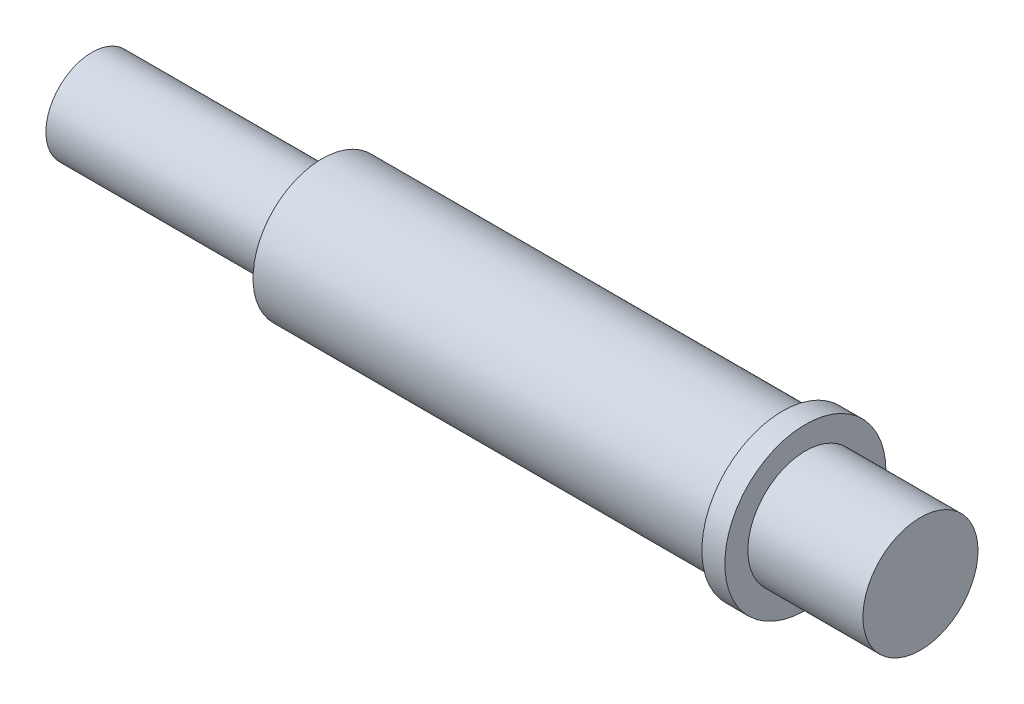
ISO-10303-21;
HEADER;
FILE_DESCRIPTION(('STEP AP214'),'2;1');
FILE_NAME('part.step','',(''),(''),'','','');
FILE_SCHEMA(('AUTOMOTIVE_DESIGN { 1 0 10303 214 1 1 1 1 }'));
ENDSEC;
DATA;
#1=APPLICATION_CONTEXT('core data for automotive mechanical design processes');
#2=APPLICATION_PROTOCOL_DEFINITION('international standard','automotive_design',2000,#1);
#3=PRODUCT_CONTEXT('',#1,'mechanical');
#4=PRODUCT('Part','Part','',(#3));
#5=PRODUCT_RELATED_PRODUCT_CATEGORY('part','',(#4));
#6=PRODUCT_DEFINITION_FORMATION('','',#4);
#7=PRODUCT_DEFINITION_CONTEXT('part definition',#1,'design');
#8=PRODUCT_DEFINITION('design','',#6,#7);
#9=PRODUCT_DEFINITION_SHAPE('','',#8);
#10=(LENGTH_UNIT() NAMED_UNIT(*) SI_UNIT(.MILLI.,.METRE.));
#11=(NAMED_UNIT(*) PLANE_ANGLE_UNIT() SI_UNIT($,.RADIAN.));
#12=(NAMED_UNIT(*) SI_UNIT($,.STERADIAN.) SOLID_ANGLE_UNIT());
#13=UNCERTAINTY_MEASURE_WITH_UNIT(LENGTH_MEASURE(1.E-05),#10,'distance_accuracy_value','');
#14=(GEOMETRIC_REPRESENTATION_CONTEXT(3) GLOBAL_UNCERTAINTY_ASSIGNED_CONTEXT((#13)) GLOBAL_UNIT_ASSIGNED_CONTEXT((#10,
#11,#12)) REPRESENTATION_CONTEXT('',''));
#15=CARTESIAN_POINT('',(0.,0.,0.));
#16=DIRECTION('',(0.,0.,1.));
#17=DIRECTION('',(1.,0.,0.));
#18=AXIS2_PLACEMENT_3D('',#15,#16,#17);
#19=CARTESIAN_POINT('',(310.,0.,0.));
#20=DIRECTION('',(1.,0.,0.));
#21=DIRECTION('',(0.,0.,-1.));
#22=AXIS2_PLACEMENT_3D('',#19,#20,#21);
#23=PLANE('',#22);
#24=CARTESIAN_POINT('',(310.,0.,0.));
#25=DIRECTION('',(1.,0.,0.));
#26=DIRECTION('',(0.,0.,-1.));
#27=AXIS2_PLACEMENT_3D('',#24,#25,#26);
#28=CIRCLE('',#27,35.);
#29=CARTESIAN_POINT('',(310.,0.,-35.));
#30=VERTEX_POINT('',#29);
#31=EDGE_CURVE('E48',#30,#30,#28,.T.);
#32=ORIENTED_EDGE('',*,*,#31,.T.);
#33=EDGE_LOOP('',(#32));
#34=FACE_BOUND('',#33,.T.);
#35=CARTESIAN_POINT('',(310.,0.,0.));
#36=DIRECTION('',(1.,0.,0.));
#37=DIRECTION('',(0.,0.,-1.));
#38=AXIS2_PLACEMENT_3D('',#35,#36,#37);
#39=CIRCLE('',#38,25.);
#40=CARTESIAN_POINT('',(310.,0.,-25.));
#41=VERTEX_POINT('',#40);
#42=EDGE_CURVE('E57',#41,#41,#39,.T.);
#43=ORIENTED_EDGE('',*,*,#42,.F.);
#44=EDGE_LOOP('',(#43));
#45=FACE_BOUND('',#44,.T.);
#46=ADVANCED_FACE('F32',(#34,#45),#23,.T.);
#47=CARTESIAN_POINT('',(100.,0.,0.));
#48=DIRECTION('',(-1.,0.,0.));
#49=DIRECTION('',(0.,0.,1.));
#50=AXIS2_PLACEMENT_3D('',#47,#48,#49);
#51=CYLINDRICAL_SURFACE('',#50,20.);
#52=CARTESIAN_POINT('',(100.,0.,0.));
#53=DIRECTION('',(1.,0.,0.));
#54=DIRECTION('',(0.,0.,-1.));
#55=AXIS2_PLACEMENT_3D('',#52,#53,#54);
#56=CIRCLE('',#55,20.);
#57=CARTESIAN_POINT('',(100.,0.,-20.));
#58=VERTEX_POINT('',#57);
#59=EDGE_CURVE('E10',#58,#58,#56,.T.);
#60=ORIENTED_EDGE('',*,*,#59,.F.);
#61=EDGE_LOOP('',(#60));
#62=FACE_BOUND('',#61,.T.);
#63=CARTESIAN_POINT('',(0.,0.,0.));
#64=DIRECTION('',(1.,0.,0.));
#65=DIRECTION('',(0.,0.,-1.));
#66=AXIS2_PLACEMENT_3D('',#63,#64,#65);
#67=CIRCLE('',#66,20.);
#68=CARTESIAN_POINT('',(0.,0.,-20.));
#69=VERTEX_POINT('',#68);
#70=EDGE_CURVE('E36',#69,#69,#67,.T.);
#71=ORIENTED_EDGE('',*,*,#70,.T.);
#72=EDGE_LOOP('',(#71));
#73=FACE_BOUND('',#72,.T.);
#74=ADVANCED_FACE('F34',(#62,#73),#51,.T.);
#75=CARTESIAN_POINT('',(0.,0.,0.));
#76=DIRECTION('',(1.,0.,0.));
#77=DIRECTION('',(0.,0.,-1.));
#78=AXIS2_PLACEMENT_3D('',#75,#76,#77);
#79=PLANE('',#78);
#80=ORIENTED_EDGE('',*,*,#70,.F.);
#81=EDGE_LOOP('',(#80));
#82=FACE_BOUND('',#81,.T.);
#83=ADVANCED_FACE('F78',(#82),#79,.F.);
#84=CARTESIAN_POINT('',(100.,0.,0.));
#85=DIRECTION('',(1.,0.,0.));
#86=DIRECTION('',(0.,0.,-1.));
#87=AXIS2_PLACEMENT_3D('',#84,#85,#86);
#88=PLANE('',#87);
#89=CARTESIAN_POINT('',(100.,0.,0.));
#90=DIRECTION('',(1.,0.,0.));
#91=DIRECTION('',(0.,0.,-1.));
#92=AXIS2_PLACEMENT_3D('',#89,#90,#91);
#93=CIRCLE('',#92,30.);
#94=CARTESIAN_POINT('',(100.,0.,-30.));
#95=VERTEX_POINT('',#94);
#96=EDGE_CURVE('E45',#95,#95,#93,.T.);
#97=ORIENTED_EDGE('',*,*,#96,.F.);
#98=EDGE_LOOP('',(#97));
#99=FACE_BOUND('',#98,.T.);
#100=ORIENTED_EDGE('',*,*,#59,.T.);
#101=EDGE_LOOP('',(#100));
#102=FACE_BOUND('',#101,.T.);
#103=ADVANCED_FACE('F90',(#99,#102),#88,.F.);
#104=CARTESIAN_POINT('',(300.,0.,0.));
#105=DIRECTION('',(-1.,0.,0.));
#106=DIRECTION('',(0.,0.,1.));
#107=AXIS2_PLACEMENT_3D('',#104,#105,#106);
#108=CYLINDRICAL_SURFACE('',#107,30.);
#109=CARTESIAN_POINT('',(300.,0.,0.));
#110=DIRECTION('',(1.,0.,0.));
#111=DIRECTION('',(0.,0.,-1.));
#112=AXIS2_PLACEMENT_3D('',#109,#110,#111);
#113=CIRCLE('',#112,30.);
#114=CARTESIAN_POINT('',(300.,0.,-30.));
#115=VERTEX_POINT('',#114);
#116=EDGE_CURVE('E43',#115,#115,#113,.T.);
#117=ORIENTED_EDGE('',*,*,#116,.F.);
#118=EDGE_LOOP('',(#117));
#119=FACE_BOUND('',#118,.T.);
#120=ORIENTED_EDGE('',*,*,#96,.T.);
#121=EDGE_LOOP('',(#120));
#122=FACE_BOUND('',#121,.T.);
#123=ADVANCED_FACE('F85',(#119,#122),#108,.T.);
#124=CARTESIAN_POINT('',(300.,0.,0.));
#125=DIRECTION('',(1.,0.,0.));
#126=DIRECTION('',(0.,0.,-1.));
#127=AXIS2_PLACEMENT_3D('',#124,#125,#126);
#128=PLANE('',#127);
#129=CARTESIAN_POINT('',(300.,0.,0.));
#130=DIRECTION('',(1.,0.,0.));
#131=DIRECTION('',(0.,0.,-1.));
#132=AXIS2_PLACEMENT_3D('',#129,#130,#131);
#133=CIRCLE('',#132,35.);
#134=CARTESIAN_POINT('',(300.,0.,-35.));
#135=VERTEX_POINT('',#134);
#136=EDGE_CURVE('E51',#135,#135,#133,.T.);
#137=ORIENTED_EDGE('',*,*,#136,.F.);
#138=EDGE_LOOP('',(#137));
#139=FACE_BOUND('',#138,.T.);
#140=ORIENTED_EDGE('',*,*,#116,.T.);
#141=EDGE_LOOP('',(#140));
#142=FACE_BOUND('',#141,.T.);
#143=ADVANCED_FACE('F82',(#139,#142),#128,.F.);
#144=CARTESIAN_POINT('',(310.,0.,0.));
#145=DIRECTION('',(-1.,0.,0.));
#146=DIRECTION('',(0.,0.,1.));
#147=AXIS2_PLACEMENT_3D('',#144,#145,#146);
#148=CYLINDRICAL_SURFACE('',#147,35.);
#149=ORIENTED_EDGE('',*,*,#31,.F.);
#150=EDGE_LOOP('',(#149));
#151=FACE_BOUND('',#150,.T.);
#152=ORIENTED_EDGE('',*,*,#136,.T.);
#153=EDGE_LOOP('',(#152));
#154=FACE_BOUND('',#153,.T.);
#155=ADVANCED_FACE('F68',(#151,#154),#148,.T.);
#156=CARTESIAN_POINT('',(360.,0.,0.));
#157=DIRECTION('',(-1.,0.,0.));
#158=DIRECTION('',(0.,0.,1.));
#159=AXIS2_PLACEMENT_3D('',#156,#157,#158);
#160=CYLINDRICAL_SURFACE('',#159,25.);
#161=CARTESIAN_POINT('',(360.,0.,0.));
#162=DIRECTION('',(1.,0.,0.));
#163=DIRECTION('',(0.,0.,-1.));
#164=AXIS2_PLACEMENT_3D('',#161,#162,#163);
#165=CIRCLE('',#164,25.);
#166=CARTESIAN_POINT('',(360.,0.,-25.));
#167=VERTEX_POINT('',#166);
#168=EDGE_CURVE('E54',#167,#167,#165,.T.);
#169=ORIENTED_EDGE('',*,*,#168,.F.);
#170=EDGE_LOOP('',(#169));
#171=FACE_BOUND('',#170,.T.);
#172=ORIENTED_EDGE('',*,*,#42,.T.);
#173=EDGE_LOOP('',(#172));
#174=FACE_BOUND('',#173,.T.);
#175=ADVANCED_FACE('F65',(#171,#174),#160,.T.);
#176=CARTESIAN_POINT('',(360.,0.,0.));
#177=DIRECTION('',(1.,0.,0.));
#178=DIRECTION('',(0.,0.,-1.));
#179=AXIS2_PLACEMENT_3D('',#176,#177,#178);
#180=PLANE('',#179);
#181=ORIENTED_EDGE('',*,*,#168,.T.);
#182=EDGE_LOOP('',(#181));
#183=FACE_BOUND('',#182,.T.);
#184=ADVANCED_FACE('F63',(#183),#180,.T.);
#185=CLOSED_SHELL('',(#46,#74,#83,#103,#123,#143,#155,#175,#184));
#186=MANIFOLD_SOLID_BREP('B2',#185);
#187=ADVANCED_BREP_SHAPE_REPRESENTATION('',(#18,#186),#14);
#188=SHAPE_DEFINITION_REPRESENTATION(#9,#187);
ENDSEC;
END-ISO-10303-21;
